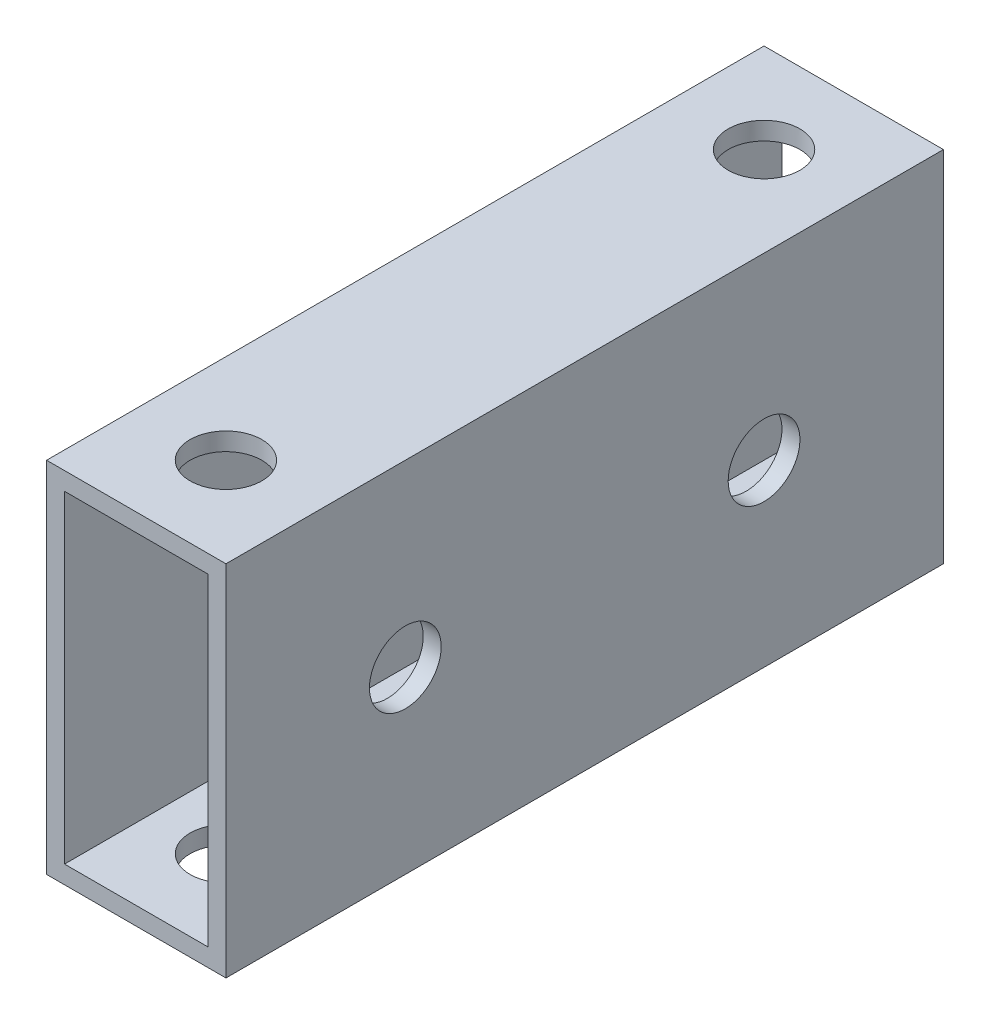
ISO-10303-21;
HEADER;
FILE_DESCRIPTION(('STEP AP214'),'2;1');
FILE_NAME('part.step','',(''),(''),'','','');
FILE_SCHEMA(('AUTOMOTIVE_DESIGN { 1 0 10303 214 1 1 1 1 }'));
ENDSEC;
DATA;
#1=APPLICATION_CONTEXT('core data for automotive mechanical design processes');
#2=APPLICATION_PROTOCOL_DEFINITION('international standard','automotive_design',2000,#1);
#3=PRODUCT_CONTEXT('',#1,'mechanical');
#4=PRODUCT('Part','Part','',(#3));
#5=PRODUCT_RELATED_PRODUCT_CATEGORY('part','',(#4));
#6=PRODUCT_DEFINITION_FORMATION('','',#4);
#7=PRODUCT_DEFINITION_CONTEXT('part definition',#1,'design');
#8=PRODUCT_DEFINITION('design','',#6,#7);
#9=PRODUCT_DEFINITION_SHAPE('','',#8);
#10=(LENGTH_UNIT() NAMED_UNIT(*) SI_UNIT(.MILLI.,.METRE.));
#11=(NAMED_UNIT(*) PLANE_ANGLE_UNIT() SI_UNIT($,.RADIAN.));
#12=(NAMED_UNIT(*) SI_UNIT($,.STERADIAN.) SOLID_ANGLE_UNIT());
#13=UNCERTAINTY_MEASURE_WITH_UNIT(LENGTH_MEASURE(1.E-05),#10,'distance_accuracy_value','');
#14=(GEOMETRIC_REPRESENTATION_CONTEXT(3) GLOBAL_UNCERTAINTY_ASSIGNED_CONTEXT((#13)) GLOBAL_UNIT_ASSIGNED_CONTEXT((#10,
#11,#12)) REPRESENTATION_CONTEXT('',''));
#15=CARTESIAN_POINT('',(0.,0.,0.));
#16=DIRECTION('',(0.,0.,1.));
#17=DIRECTION('',(1.,0.,0.));
#18=AXIS2_PLACEMENT_3D('',#15,#16,#17);
#19=CARTESIAN_POINT('',(0.,0.,40.));
#20=DIRECTION('',(0.,0.,1.));
#21=DIRECTION('',(1.,0.,0.));
#22=AXIS2_PLACEMENT_3D('',#19,#20,#21);
#23=PLANE('',#22);
#24=DIRECTION('',(0.,-1.,0.));
#25=VECTOR('',#24,1.);
#26=CARTESIAN_POINT('',(-5.,-10.,40.));
#27=LINE('',#26,#25);
#28=CARTESIAN_POINT('',(-5.,10.,40.));
#29=VERTEX_POINT('',#28);
#30=CARTESIAN_POINT('',(-5.,-10.,40.));
#31=VERTEX_POINT('',#30);
#32=EDGE_CURVE('E181',#29,#31,#27,.T.);
#33=ORIENTED_EDGE('',*,*,#32,.T.);
#34=DIRECTION('',(1.,0.,0.));
#35=VECTOR('',#34,1.);
#36=CARTESIAN_POINT('',(5.,-10.,40.));
#37=LINE('',#36,#35);
#38=CARTESIAN_POINT('',(5.,-10.,40.));
#39=VERTEX_POINT('',#38);
#40=EDGE_CURVE('E185',#31,#39,#37,.T.);
#41=ORIENTED_EDGE('',*,*,#40,.T.);
#42=DIRECTION('',(0.,1.,0.));
#43=VECTOR('',#42,1.);
#44=CARTESIAN_POINT('',(5.,-10.,40.));
#45=LINE('',#44,#43);
#46=CARTESIAN_POINT('',(5.,10.,40.));
#47=VERTEX_POINT('',#46);
#48=EDGE_CURVE('E189',#39,#47,#45,.T.);
#49=ORIENTED_EDGE('',*,*,#48,.T.);
#50=DIRECTION('',(-1.,0.,0.));
#51=VECTOR('',#50,1.);
#52=CARTESIAN_POINT('',(5.,10.,40.));
#53=LINE('',#52,#51);
#54=EDGE_CURVE('E192',#47,#29,#53,.T.);
#55=ORIENTED_EDGE('',*,*,#54,.T.);
#56=EDGE_LOOP('',(#33,#41,#49,#55));
#57=FACE_BOUND('',#56,.T.);
#58=DIRECTION('',(1.,0.,0.));
#59=VECTOR('',#58,1.);
#60=CARTESIAN_POINT('',(5.,-9.,40.));
#61=LINE('',#60,#59);
#62=CARTESIAN_POINT('',(-4.,-9.,40.));
#63=VERTEX_POINT('',#62);
#64=CARTESIAN_POINT('',(4.,-9.,40.));
#65=VERTEX_POINT('',#64);
#66=EDGE_CURVE('E140',#63,#65,#61,.T.);
#67=ORIENTED_EDGE('',*,*,#66,.F.);
#68=DIRECTION('',(0.,-1.,0.));
#69=VECTOR('',#68,1.);
#70=CARTESIAN_POINT('',(-4.,-10.,40.));
#71=LINE('',#70,#69);
#72=CARTESIAN_POINT('',(-4.,9.,40.));
#73=VERTEX_POINT('',#72);
#74=EDGE_CURVE('E131',#73,#63,#71,.T.);
#75=ORIENTED_EDGE('',*,*,#74,.F.);
#76=DIRECTION('',(-1.,0.,0.));
#77=VECTOR('',#76,1.);
#78=CARTESIAN_POINT('',(5.,9.,40.));
#79=LINE('',#78,#77);
#80=CARTESIAN_POINT('',(4.,9.,40.));
#81=VERTEX_POINT('',#80);
#82=EDGE_CURVE('E157',#81,#73,#79,.T.);
#83=ORIENTED_EDGE('',*,*,#82,.F.);
#84=DIRECTION('',(0.,1.,0.));
#85=VECTOR('',#84,1.);
#86=CARTESIAN_POINT('',(4.,-10.,40.));
#87=LINE('',#86,#85);
#88=EDGE_CURVE('E153',#65,#81,#87,.T.);
#89=ORIENTED_EDGE('',*,*,#88,.F.);
#90=EDGE_LOOP('',(#67,#75,#83,#89));
#91=FACE_BOUND('',#90,.T.);
#92=ADVANCED_FACE('F63',(#57,#91),#23,.T.);
#93=CARTESIAN_POINT('',(0.,0.,0.));
#94=DIRECTION('',(0.,0.,1.));
#95=DIRECTION('',(1.,0.,0.));
#96=AXIS2_PLACEMENT_3D('',#93,#94,#95);
#97=PLANE('',#96);
#98=DIRECTION('',(0.,-1.,0.));
#99=VECTOR('',#98,1.);
#100=CARTESIAN_POINT('',(-5.,-10.,0.));
#101=LINE('',#100,#99);
#102=CARTESIAN_POINT('',(-5.,10.,0.));
#103=VERTEX_POINT('',#102);
#104=CARTESIAN_POINT('',(-5.,-10.,0.));
#105=VERTEX_POINT('',#104);
#106=EDGE_CURVE('E149',#103,#105,#101,.T.);
#107=ORIENTED_EDGE('',*,*,#106,.F.);
#108=DIRECTION('',(-1.,0.,0.));
#109=VECTOR('',#108,1.);
#110=CARTESIAN_POINT('',(5.,10.,0.));
#111=LINE('',#110,#109);
#112=CARTESIAN_POINT('',(5.,10.,0.));
#113=VERTEX_POINT('',#112);
#114=EDGE_CURVE('E186',#113,#103,#111,.T.);
#115=ORIENTED_EDGE('',*,*,#114,.F.);
#116=DIRECTION('',(0.,1.,0.));
#117=VECTOR('',#116,1.);
#118=CARTESIAN_POINT('',(5.,-10.,0.));
#119=LINE('',#118,#117);
#120=CARTESIAN_POINT('',(5.,-10.,0.));
#121=VERTEX_POINT('',#120);
#122=EDGE_CURVE('E202',#121,#113,#119,.T.);
#123=ORIENTED_EDGE('',*,*,#122,.F.);
#124=DIRECTION('',(1.,0.,0.));
#125=VECTOR('',#124,1.);
#126=CARTESIAN_POINT('',(5.,-10.,0.));
#127=LINE('',#126,#125);
#128=EDGE_CURVE('E199',#105,#121,#127,.T.);
#129=ORIENTED_EDGE('',*,*,#128,.F.);
#130=EDGE_LOOP('',(#107,#115,#123,#129));
#131=FACE_BOUND('',#130,.T.);
#132=DIRECTION('',(0.,-1.,0.));
#133=VECTOR('',#132,1.);
#134=CARTESIAN_POINT('',(-4.,-10.,0.));
#135=LINE('',#134,#133);
#136=CARTESIAN_POINT('',(-4.,9.,0.));
#137=VERTEX_POINT('',#136);
#138=CARTESIAN_POINT('',(-4.,-9.,0.));
#139=VERTEX_POINT('',#138);
#140=EDGE_CURVE('E89',#137,#139,#135,.T.);
#141=ORIENTED_EDGE('',*,*,#140,.T.);
#142=DIRECTION('',(1.,0.,0.));
#143=VECTOR('',#142,1.);
#144=CARTESIAN_POINT('',(5.,-9.,0.));
#145=LINE('',#144,#143);
#146=CARTESIAN_POINT('',(4.,-9.,0.));
#147=VERTEX_POINT('',#146);
#148=EDGE_CURVE('E147',#139,#147,#145,.T.);
#149=ORIENTED_EDGE('',*,*,#148,.T.);
#150=DIRECTION('',(0.,1.,0.));
#151=VECTOR('',#150,1.);
#152=CARTESIAN_POINT('',(4.,-10.,0.));
#153=LINE('',#152,#151);
#154=CARTESIAN_POINT('',(4.,9.,0.));
#155=VERTEX_POINT('',#154);
#156=EDGE_CURVE('E168',#147,#155,#153,.T.);
#157=ORIENTED_EDGE('',*,*,#156,.T.);
#158=DIRECTION('',(-1.,0.,0.));
#159=VECTOR('',#158,1.);
#160=CARTESIAN_POINT('',(5.,9.,0.));
#161=LINE('',#160,#159);
#162=EDGE_CURVE('E141',#155,#137,#161,.T.);
#163=ORIENTED_EDGE('',*,*,#162,.T.);
#164=EDGE_LOOP('',(#141,#149,#157,#163));
#165=FACE_BOUND('',#164,.T.);
#166=ADVANCED_FACE('F299',(#131,#165),#97,.F.);
#167=CARTESIAN_POINT('',(-5.,-10.,40.));
#168=DIRECTION('',(1.,0.,0.));
#169=DIRECTION('',(0.,0.,-1.));
#170=AXIS2_PLACEMENT_3D('',#167,#168,#169);
#171=PLANE('',#170);
#172=CARTESIAN_POINT('',(-5.,0.,10.));
#173=DIRECTION('',(-1.,0.,0.));
#174=DIRECTION('',(0.,0.,1.));
#175=AXIS2_PLACEMENT_3D('',#172,#173,#174);
#176=CIRCLE('',#175,2.);
#177=CARTESIAN_POINT('',(-5.,0.,12.));
#178=VERTEX_POINT('',#177);
#179=EDGE_CURVE('E262',#178,#178,#176,.T.);
#180=ORIENTED_EDGE('',*,*,#179,.F.);
#181=EDGE_LOOP('',(#180));
#182=FACE_BOUND('',#181,.T.);
#183=CARTESIAN_POINT('',(-5.,0.,30.));
#184=DIRECTION('',(-1.,0.,0.));
#185=DIRECTION('',(0.,0.,-1.));
#186=AXIS2_PLACEMENT_3D('',#183,#184,#185);
#187=CIRCLE('',#186,2.);
#188=CARTESIAN_POINT('',(-5.,0.,28.));
#189=VERTEX_POINT('',#188);
#190=EDGE_CURVE('E258',#189,#189,#187,.T.);
#191=ORIENTED_EDGE('',*,*,#190,.F.);
#192=EDGE_LOOP('',(#191));
#193=FACE_BOUND('',#192,.T.);
#194=ORIENTED_EDGE('',*,*,#106,.T.);
#195=DIRECTION('',(0.,0.,-1.));
#196=VECTOR('',#195,1.);
#197=CARTESIAN_POINT('',(-5.,-10.,40.));
#198=LINE('',#197,#196);
#199=EDGE_CURVE('E12',#31,#105,#198,.T.);
#200=ORIENTED_EDGE('',*,*,#199,.F.);
#201=ORIENTED_EDGE('',*,*,#32,.F.);
#202=DIRECTION('',(0.,0.,-1.));
#203=VECTOR('',#202,1.);
#204=CARTESIAN_POINT('',(-5.,10.,40.));
#205=LINE('',#204,#203);
#206=EDGE_CURVE('E195',#29,#103,#205,.T.);
#207=ORIENTED_EDGE('',*,*,#206,.T.);
#208=EDGE_LOOP('',(#194,#200,#201,#207));
#209=FACE_BOUND('',#208,.T.);
#210=ADVANCED_FACE('F65',(#182,#193,#209),#171,.F.);
#211=CARTESIAN_POINT('',(5.,-10.,40.));
#212=DIRECTION('',(0.,1.,0.));
#213=DIRECTION('',(-1.,0.,0.));
#214=AXIS2_PLACEMENT_3D('',#211,#212,#213);
#215=PLANE('',#214);
#216=CARTESIAN_POINT('',(0.,-10.,5.));
#217=DIRECTION('',(0.,1.,0.));
#218=DIRECTION('',(0.,0.,1.));
#219=AXIS2_PLACEMENT_3D('',#216,#217,#218);
#220=CIRCLE('',#219,2.);
#221=CARTESIAN_POINT('',(0.,-10.,7.));
#222=VERTEX_POINT('',#221);
#223=EDGE_CURVE('E230',#222,#222,#220,.T.);
#224=ORIENTED_EDGE('',*,*,#223,.T.);
#225=EDGE_LOOP('',(#224));
#226=FACE_BOUND('',#225,.T.);
#227=CARTESIAN_POINT('',(0.,-10.,35.));
#228=DIRECTION('',(0.,1.,0.));
#229=DIRECTION('',(0.,0.,-1.));
#230=AXIS2_PLACEMENT_3D('',#227,#228,#229);
#231=CIRCLE('',#230,2.);
#232=CARTESIAN_POINT('',(0.,-10.,33.));
#233=VERTEX_POINT('',#232);
#234=EDGE_CURVE('E244',#233,#233,#231,.T.);
#235=ORIENTED_EDGE('',*,*,#234,.T.);
#236=EDGE_LOOP('',(#235));
#237=FACE_BOUND('',#236,.T.);
#238=ORIENTED_EDGE('',*,*,#128,.T.);
#239=DIRECTION('',(0.,0.,-1.));
#240=VECTOR('',#239,1.);
#241=CARTESIAN_POINT('',(5.,-10.,40.));
#242=LINE('',#241,#240);
#243=EDGE_CURVE('E73',#39,#121,#242,.T.);
#244=ORIENTED_EDGE('',*,*,#243,.F.);
#245=ORIENTED_EDGE('',*,*,#40,.F.);
#246=ORIENTED_EDGE('',*,*,#199,.T.);
#247=EDGE_LOOP('',(#238,#244,#245,#246));
#248=FACE_BOUND('',#247,.T.);
#249=ADVANCED_FACE('F298',(#226,#237,#248),#215,.F.);
#250=CARTESIAN_POINT('',(5.,-10.,40.));
#251=DIRECTION('',(-1.,0.,0.));
#252=DIRECTION('',(0.,0.,1.));
#253=AXIS2_PLACEMENT_3D('',#250,#251,#252);
#254=PLANE('',#253);
#255=CARTESIAN_POINT('',(5.,0.,10.));
#256=DIRECTION('',(-1.,0.,0.));
#257=DIRECTION('',(0.,0.,1.));
#258=AXIS2_PLACEMENT_3D('',#255,#256,#257);
#259=CIRCLE('',#258,2.);
#260=CARTESIAN_POINT('',(5.,0.,12.));
#261=VERTEX_POINT('',#260);
#262=EDGE_CURVE('E222',#261,#261,#259,.T.);
#263=ORIENTED_EDGE('',*,*,#262,.T.);
#264=EDGE_LOOP('',(#263));
#265=FACE_BOUND('',#264,.T.);
#266=CARTESIAN_POINT('',(5.,0.,30.));
#267=DIRECTION('',(-1.,0.,0.));
#268=DIRECTION('',(0.,0.,-1.));
#269=AXIS2_PLACEMENT_3D('',#266,#267,#268);
#270=CIRCLE('',#269,2.);
#271=CARTESIAN_POINT('',(5.,0.,28.));
#272=VERTEX_POINT('',#271);
#273=EDGE_CURVE('E266',#272,#272,#270,.T.);
#274=ORIENTED_EDGE('',*,*,#273,.T.);
#275=EDGE_LOOP('',(#274));
#276=FACE_BOUND('',#275,.T.);
#277=ORIENTED_EDGE('',*,*,#122,.T.);
#278=DIRECTION('',(0.,0.,-1.));
#279=VECTOR('',#278,1.);
#280=CARTESIAN_POINT('',(5.,10.,40.));
#281=LINE('',#280,#279);
#282=EDGE_CURVE('E210',#47,#113,#281,.T.);
#283=ORIENTED_EDGE('',*,*,#282,.F.);
#284=ORIENTED_EDGE('',*,*,#48,.F.);
#285=ORIENTED_EDGE('',*,*,#243,.T.);
#286=EDGE_LOOP('',(#277,#283,#284,#285));
#287=FACE_BOUND('',#286,.T.);
#288=ADVANCED_FACE('F317',(#265,#276,#287),#254,.F.);
#289=CARTESIAN_POINT('',(5.,10.,40.));
#290=DIRECTION('',(0.,-1.,0.));
#291=DIRECTION('',(0.,0.,-1.));
#292=AXIS2_PLACEMENT_3D('',#289,#290,#291);
#293=PLANE('',#292);
#294=CARTESIAN_POINT('',(0.,10.,5.));
#295=DIRECTION('',(0.,1.,0.));
#296=DIRECTION('',(0.,0.,1.));
#297=AXIS2_PLACEMENT_3D('',#294,#295,#296);
#298=CIRCLE('',#297,2.);
#299=CARTESIAN_POINT('',(0.,10.,7.));
#300=VERTEX_POINT('',#299);
#301=EDGE_CURVE('E238',#300,#300,#298,.T.);
#302=ORIENTED_EDGE('',*,*,#301,.F.);
#303=EDGE_LOOP('',(#302));
#304=FACE_BOUND('',#303,.T.);
#305=CARTESIAN_POINT('',(0.,10.,35.));
#306=DIRECTION('',(0.,1.,0.));
#307=DIRECTION('',(0.,0.,-1.));
#308=AXIS2_PLACEMENT_3D('',#305,#306,#307);
#309=CIRCLE('',#308,2.);
#310=CARTESIAN_POINT('',(0.,10.,33.));
#311=VERTEX_POINT('',#310);
#312=EDGE_CURVE('E250',#311,#311,#309,.T.);
#313=ORIENTED_EDGE('',*,*,#312,.F.);
#314=EDGE_LOOP('',(#313));
#315=FACE_BOUND('',#314,.T.);
#316=ORIENTED_EDGE('',*,*,#114,.T.);
#317=ORIENTED_EDGE('',*,*,#206,.F.);
#318=ORIENTED_EDGE('',*,*,#54,.F.);
#319=ORIENTED_EDGE('',*,*,#282,.T.);
#320=EDGE_LOOP('',(#316,#317,#318,#319));
#321=FACE_BOUND('',#320,.T.);
#322=ADVANCED_FACE('F284',(#304,#315,#321),#293,.F.);
#323=CARTESIAN_POINT('',(-4.,-10.,40.));
#324=DIRECTION('',(1.,0.,0.));
#325=DIRECTION('',(0.,0.,-1.));
#326=AXIS2_PLACEMENT_3D('',#323,#324,#325);
#327=PLANE('',#326);
#328=CARTESIAN_POINT('',(-4.,0.,10.));
#329=DIRECTION('',(1.,0.,0.));
#330=DIRECTION('',(0.,0.,-1.));
#331=AXIS2_PLACEMENT_3D('',#328,#329,#330);
#332=CIRCLE('',#331,2.);
#333=CARTESIAN_POINT('',(-4.,0.,8.));
#334=VERTEX_POINT('',#333);
#335=EDGE_CURVE('E165',#334,#334,#332,.T.);
#336=ORIENTED_EDGE('',*,*,#335,.F.);
#337=EDGE_LOOP('',(#336));
#338=FACE_BOUND('',#337,.T.);
#339=CARTESIAN_POINT('',(-4.,0.,30.));
#340=DIRECTION('',(1.,0.,0.));
#341=DIRECTION('',(0.,0.,-1.));
#342=AXIS2_PLACEMENT_3D('',#339,#340,#341);
#343=CIRCLE('',#342,2.);
#344=CARTESIAN_POINT('',(-4.,0.,28.));
#345=VERTEX_POINT('',#344);
#346=EDGE_CURVE('E221',#345,#345,#343,.T.);
#347=ORIENTED_EDGE('',*,*,#346,.F.);
#348=EDGE_LOOP('',(#347));
#349=FACE_BOUND('',#348,.T.);
#350=ORIENTED_EDGE('',*,*,#140,.F.);
#351=DIRECTION('',(0.,0.,-1.));
#352=VECTOR('',#351,1.);
#353=CARTESIAN_POINT('',(-4.,9.,40.));
#354=LINE('',#353,#352);
#355=EDGE_CURVE('E135',#73,#137,#354,.T.);
#356=ORIENTED_EDGE('',*,*,#355,.F.);
#357=ORIENTED_EDGE('',*,*,#74,.T.);
#358=DIRECTION('',(0.,0.,-1.));
#359=VECTOR('',#358,1.);
#360=CARTESIAN_POINT('',(-4.,-9.,40.));
#361=LINE('',#360,#359);
#362=EDGE_CURVE('E134',#63,#139,#361,.T.);
#363=ORIENTED_EDGE('',*,*,#362,.T.);
#364=EDGE_LOOP('',(#350,#356,#357,#363));
#365=FACE_BOUND('',#364,.T.);
#366=ADVANCED_FACE('F133',(#338,#349,#365),#327,.T.);
#367=CARTESIAN_POINT('',(5.,-9.,40.));
#368=DIRECTION('',(0.,1.,0.));
#369=DIRECTION('',(-1.,0.,0.));
#370=AXIS2_PLACEMENT_3D('',#367,#368,#369);
#371=PLANE('',#370);
#372=CARTESIAN_POINT('',(0.,-9.,5.));
#373=DIRECTION('',(0.,1.,0.));
#374=DIRECTION('',(-1.,0.,0.));
#375=AXIS2_PLACEMENT_3D('',#372,#373,#374);
#376=CIRCLE('',#375,2.);
#377=CARTESIAN_POINT('',(-2.,-9.,5.));
#378=VERTEX_POINT('',#377);
#379=EDGE_CURVE('E254',#378,#378,#376,.T.);
#380=ORIENTED_EDGE('',*,*,#379,.F.);
#381=EDGE_LOOP('',(#380));
#382=FACE_BOUND('',#381,.T.);
#383=CARTESIAN_POINT('',(0.,-9.,35.));
#384=DIRECTION('',(0.,1.,0.));
#385=DIRECTION('',(-1.,0.,0.));
#386=AXIS2_PLACEMENT_3D('',#383,#384,#385);
#387=CIRCLE('',#386,2.);
#388=CARTESIAN_POINT('',(-2.,-9.,35.));
#389=VERTEX_POINT('',#388);
#390=EDGE_CURVE('E229',#389,#389,#387,.T.);
#391=ORIENTED_EDGE('',*,*,#390,.F.);
#392=EDGE_LOOP('',(#391));
#393=FACE_BOUND('',#392,.T.);
#394=ORIENTED_EDGE('',*,*,#148,.F.);
#395=ORIENTED_EDGE('',*,*,#362,.F.);
#396=ORIENTED_EDGE('',*,*,#66,.T.);
#397=DIRECTION('',(0.,0.,-1.));
#398=VECTOR('',#397,1.);
#399=CARTESIAN_POINT('',(4.,-9.,40.));
#400=LINE('',#399,#398);
#401=EDGE_CURVE('E150',#65,#147,#400,.T.);
#402=ORIENTED_EDGE('',*,*,#401,.T.);
#403=EDGE_LOOP('',(#394,#395,#396,#402));
#404=FACE_BOUND('',#403,.T.);
#405=ADVANCED_FACE('F144',(#382,#393,#404),#371,.T.);
#406=CARTESIAN_POINT('',(4.,-10.,40.));
#407=DIRECTION('',(-1.,0.,0.));
#408=DIRECTION('',(0.,0.,1.));
#409=AXIS2_PLACEMENT_3D('',#406,#407,#408);
#410=PLANE('',#409);
#411=CARTESIAN_POINT('',(4.,0.,10.));
#412=DIRECTION('',(-1.,0.,0.));
#413=DIRECTION('',(0.,0.,1.));
#414=AXIS2_PLACEMENT_3D('',#411,#412,#413);
#415=CIRCLE('',#414,2.);
#416=CARTESIAN_POINT('',(4.,0.,12.));
#417=VERTEX_POINT('',#416);
#418=EDGE_CURVE('E223',#417,#417,#415,.T.);
#419=ORIENTED_EDGE('',*,*,#418,.F.);
#420=EDGE_LOOP('',(#419));
#421=FACE_BOUND('',#420,.T.);
#422=CARTESIAN_POINT('',(4.,0.,30.));
#423=DIRECTION('',(-1.,0.,0.));
#424=DIRECTION('',(0.,0.,1.));
#425=AXIS2_PLACEMENT_3D('',#422,#423,#424);
#426=CIRCLE('',#425,2.);
#427=CARTESIAN_POINT('',(4.,0.,32.));
#428=VERTEX_POINT('',#427);
#429=EDGE_CURVE('E217',#428,#428,#426,.T.);
#430=ORIENTED_EDGE('',*,*,#429,.F.);
#431=EDGE_LOOP('',(#430));
#432=FACE_BOUND('',#431,.T.);
#433=ORIENTED_EDGE('',*,*,#156,.F.);
#434=ORIENTED_EDGE('',*,*,#401,.F.);
#435=ORIENTED_EDGE('',*,*,#88,.T.);
#436=DIRECTION('',(0.,0.,-1.));
#437=VECTOR('',#436,1.);
#438=CARTESIAN_POINT('',(4.,9.,40.));
#439=LINE('',#438,#437);
#440=EDGE_CURVE('E81',#81,#155,#439,.T.);
#441=ORIENTED_EDGE('',*,*,#440,.T.);
#442=EDGE_LOOP('',(#433,#434,#435,#441));
#443=FACE_BOUND('',#442,.T.);
#444=ADVANCED_FACE('F337',(#421,#432,#443),#410,.T.);
#445=CARTESIAN_POINT('',(5.,9.,40.));
#446=DIRECTION('',(0.,-1.,0.));
#447=DIRECTION('',(0.,0.,-1.));
#448=AXIS2_PLACEMENT_3D('',#445,#446,#447);
#449=PLANE('',#448);
#450=CARTESIAN_POINT('',(0.,9.,5.));
#451=DIRECTION('',(0.,-1.,0.));
#452=DIRECTION('',(0.,0.,-1.));
#453=AXIS2_PLACEMENT_3D('',#450,#451,#452);
#454=CIRCLE('',#453,2.);
#455=CARTESIAN_POINT('',(0.,9.,3.));
#456=VERTEX_POINT('',#455);
#457=EDGE_CURVE('E67',#456,#456,#454,.T.);
#458=ORIENTED_EDGE('',*,*,#457,.F.);
#459=EDGE_LOOP('',(#458));
#460=FACE_BOUND('',#459,.T.);
#461=CARTESIAN_POINT('',(0.,9.,35.));
#462=DIRECTION('',(0.,-1.,0.));
#463=DIRECTION('',(0.,0.,-1.));
#464=AXIS2_PLACEMENT_3D('',#461,#462,#463);
#465=CIRCLE('',#464,2.);
#466=CARTESIAN_POINT('',(0.,9.,33.));
#467=VERTEX_POINT('',#466);
#468=EDGE_CURVE('E226',#467,#467,#465,.T.);
#469=ORIENTED_EDGE('',*,*,#468,.F.);
#470=EDGE_LOOP('',(#469));
#471=FACE_BOUND('',#470,.T.);
#472=ORIENTED_EDGE('',*,*,#162,.F.);
#473=ORIENTED_EDGE('',*,*,#440,.F.);
#474=ORIENTED_EDGE('',*,*,#82,.T.);
#475=ORIENTED_EDGE('',*,*,#355,.T.);
#476=EDGE_LOOP('',(#472,#473,#474,#475));
#477=FACE_BOUND('',#476,.T.);
#478=ADVANCED_FACE('F341',(#460,#471,#477),#449,.T.);
#479=CARTESIAN_POINT('',(5.,0.,30.));
#480=DIRECTION('',(-1.,0.,0.));
#481=DIRECTION('',(0.,0.,1.));
#482=AXIS2_PLACEMENT_3D('',#479,#480,#481);
#483=CYLINDRICAL_SURFACE('',#482,2.);
#484=ORIENTED_EDGE('',*,*,#429,.T.);
#485=EDGE_LOOP('',(#484));
#486=FACE_BOUND('',#485,.T.);
#487=ORIENTED_EDGE('',*,*,#273,.F.);
#488=EDGE_LOOP('',(#487));
#489=FACE_BOUND('',#488,.T.);
#490=ADVANCED_FACE('F293',(#486,#489),#483,.F.);
#491=CARTESIAN_POINT('',(5.,0.,10.));
#492=DIRECTION('',(-1.,0.,0.));
#493=DIRECTION('',(0.,0.,1.));
#494=AXIS2_PLACEMENT_3D('',#491,#492,#493);
#495=CYLINDRICAL_SURFACE('',#494,2.);
#496=ORIENTED_EDGE('',*,*,#418,.T.);
#497=EDGE_LOOP('',(#496));
#498=FACE_BOUND('',#497,.T.);
#499=ORIENTED_EDGE('',*,*,#262,.F.);
#500=EDGE_LOOP('',(#499));
#501=FACE_BOUND('',#500,.T.);
#502=ADVANCED_FACE('F291',(#498,#501),#495,.F.);
#503=ORIENTED_EDGE('',*,*,#346,.T.);
#504=EDGE_LOOP('',(#503));
#505=FACE_BOUND('',#504,.T.);
#506=ORIENTED_EDGE('',*,*,#190,.T.);
#507=EDGE_LOOP('',(#506));
#508=FACE_BOUND('',#507,.T.);
#509=ADVANCED_FACE('F288',(#505,#508),#483,.F.);
#510=ORIENTED_EDGE('',*,*,#335,.T.);
#511=EDGE_LOOP('',(#510));
#512=FACE_BOUND('',#511,.T.);
#513=ORIENTED_EDGE('',*,*,#179,.T.);
#514=EDGE_LOOP('',(#513));
#515=FACE_BOUND('',#514,.T.);
#516=ADVANCED_FACE('F279',(#512,#515),#495,.F.);
#517=CARTESIAN_POINT('',(0.,-10.,35.));
#518=DIRECTION('',(0.,1.,0.));
#519=DIRECTION('',(0.,0.,1.));
#520=AXIS2_PLACEMENT_3D('',#517,#518,#519);
#521=CYLINDRICAL_SURFACE('',#520,2.);
#522=ORIENTED_EDGE('',*,*,#468,.T.);
#523=EDGE_LOOP('',(#522));
#524=FACE_BOUND('',#523,.T.);
#525=ORIENTED_EDGE('',*,*,#312,.T.);
#526=EDGE_LOOP('',(#525));
#527=FACE_BOUND('',#526,.T.);
#528=ADVANCED_FACE('F351',(#524,#527),#521,.F.);
#529=CARTESIAN_POINT('',(0.,-10.,5.));
#530=DIRECTION('',(0.,1.,0.));
#531=DIRECTION('',(0.,0.,1.));
#532=AXIS2_PLACEMENT_3D('',#529,#530,#531);
#533=CYLINDRICAL_SURFACE('',#532,2.);
#534=ORIENTED_EDGE('',*,*,#457,.T.);
#535=EDGE_LOOP('',(#534));
#536=FACE_BOUND('',#535,.T.);
#537=ORIENTED_EDGE('',*,*,#301,.T.);
#538=EDGE_LOOP('',(#537));
#539=FACE_BOUND('',#538,.T.);
#540=ADVANCED_FACE('F354',(#536,#539),#533,.F.);
#541=ORIENTED_EDGE('',*,*,#390,.T.);
#542=EDGE_LOOP('',(#541));
#543=FACE_BOUND('',#542,.T.);
#544=ORIENTED_EDGE('',*,*,#234,.F.);
#545=EDGE_LOOP('',(#544));
#546=FACE_BOUND('',#545,.T.);
#547=ADVANCED_FACE('F355',(#543,#546),#521,.F.);
#548=ORIENTED_EDGE('',*,*,#379,.T.);
#549=EDGE_LOOP('',(#548));
#550=FACE_BOUND('',#549,.T.);
#551=ORIENTED_EDGE('',*,*,#223,.F.);
#552=EDGE_LOOP('',(#551));
#553=FACE_BOUND('',#552,.T.);
#554=ADVANCED_FACE('F358',(#550,#553),#533,.F.);
#555=CLOSED_SHELL('',(#92,#166,#210,#249,#288,#322,#366,#405,#444,#478,#490,#502,#509,#516,#528,
#540,#547,#554));
#556=MANIFOLD_SOLID_BREP('B2',#555);
#557=ADVANCED_BREP_SHAPE_REPRESENTATION('',(#18,#556),#14);
#558=SHAPE_DEFINITION_REPRESENTATION(#9,#557);
ENDSEC;
END-ISO-10303-21;
